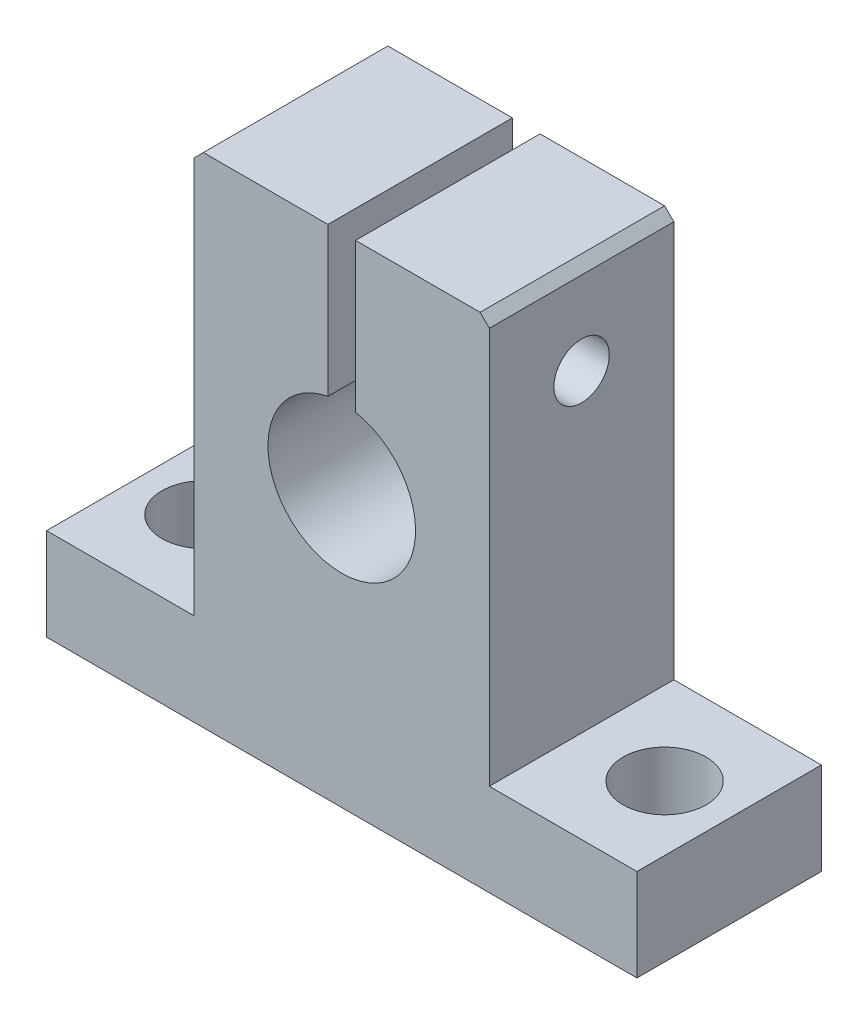
ISO-10303-21;
HEADER;
FILE_DESCRIPTION(('STEP AP214'),'2;1');
FILE_NAME('part.step','',(''),(''),'','','');
FILE_SCHEMA(('AUTOMOTIVE_DESIGN { 1 0 10303 214 1 1 1 1 }'));
ENDSEC;
DATA;
#1=APPLICATION_CONTEXT('core data for automotive mechanical design processes');
#2=APPLICATION_PROTOCOL_DEFINITION('international standard','automotive_design',2000,#1);
#3=PRODUCT_CONTEXT('',#1,'mechanical');
#4=PRODUCT('Part','Part','',(#3));
#5=PRODUCT_RELATED_PRODUCT_CATEGORY('part','',(#4));
#6=PRODUCT_DEFINITION_FORMATION('','',#4);
#7=PRODUCT_DEFINITION_CONTEXT('part definition',#1,'design');
#8=PRODUCT_DEFINITION('design','',#6,#7);
#9=PRODUCT_DEFINITION_SHAPE('','',#8);
#10=(LENGTH_UNIT() NAMED_UNIT(*) SI_UNIT(.MILLI.,.METRE.));
#11=(NAMED_UNIT(*) PLANE_ANGLE_UNIT() SI_UNIT($,.RADIAN.));
#12=(NAMED_UNIT(*) SI_UNIT($,.STERADIAN.) SOLID_ANGLE_UNIT());
#13=UNCERTAINTY_MEASURE_WITH_UNIT(LENGTH_MEASURE(1.E-05),#10,'distance_accuracy_value','');
#14=(GEOMETRIC_REPRESENTATION_CONTEXT(3) GLOBAL_UNCERTAINTY_ASSIGNED_CONTEXT((#13)) GLOBAL_UNIT_ASSIGNED_CONTEXT((#10,
#11,#12)) REPRESENTATION_CONTEXT('',''));
#15=CARTESIAN_POINT('',(0.,0.,0.));
#16=DIRECTION('',(0.,0.,1.));
#17=DIRECTION('',(1.,0.,0.));
#18=AXIS2_PLACEMENT_3D('',#15,#16,#17);
#19=CARTESIAN_POINT('',(8.,0.,0.));
#20=DIRECTION('',(0.,-1.,0.));
#21=DIRECTION('',(-1.,0.,0.));
#22=AXIS2_PLACEMENT_3D('',#19,#20,#21);
#23=PLANE('',#22);
#24=DIRECTION('',(1.,0.,0.));
#25=VECTOR('',#24,1.);
#26=CARTESIAN_POINT('',(0.,0.,-10.));
#27=LINE('',#26,#25);
#28=CARTESIAN_POINT('',(-16.,0.,-10.));
#29=VERTEX_POINT('',#28);
#30=CARTESIAN_POINT('',(16.,0.,-10.));
#31=VERTEX_POINT('',#30);
#32=EDGE_CURVE('E238',#29,#31,#27,.T.);
#33=ORIENTED_EDGE('',*,*,#32,.T.);
#34=DIRECTION('',(0.,0.,-1.));
#35=VECTOR('',#34,1.);
#36=CARTESIAN_POINT('',(16.,0.,0.));
#37=LINE('',#36,#35);
#38=CARTESIAN_POINT('',(16.,0.,0.));
#39=VERTEX_POINT('',#38);
#40=EDGE_CURVE('E396',#39,#31,#37,.T.);
#41=ORIENTED_EDGE('',*,*,#40,.F.);
#42=DIRECTION('',(1.,0.,0.));
#43=VECTOR('',#42,1.);
#44=CARTESIAN_POINT('',(0.,0.,0.));
#45=LINE('',#44,#43);
#46=CARTESIAN_POINT('',(-16.,0.,0.));
#47=VERTEX_POINT('',#46);
#48=EDGE_CURVE('E260',#47,#39,#45,.T.);
#49=ORIENTED_EDGE('',*,*,#48,.F.);
#50=DIRECTION('',(0.,0.,-1.));
#51=VECTOR('',#50,1.);
#52=CARTESIAN_POINT('',(-16.,0.,0.));
#53=LINE('',#52,#51);
#54=EDGE_CURVE('E12',#47,#29,#53,.T.);
#55=ORIENTED_EDGE('',*,*,#54,.T.);
#56=EDGE_LOOP('',(#33,#41,#49,#55));
#57=FACE_BOUND('',#56,.T.);
#58=CARTESIAN_POINT('',(12.5,0.,-5.));
#59=DIRECTION('',(0.,1.,0.));
#60=DIRECTION('',(1.,0.,0.));
#61=AXIS2_PLACEMENT_3D('',#58,#59,#60);
#62=CIRCLE('',#61,2.25);
#63=CARTESIAN_POINT('',(14.75,0.,-5.));
#64=VERTEX_POINT('',#63);
#65=EDGE_CURVE('E284',#64,#64,#62,.T.);
#66=ORIENTED_EDGE('',*,*,#65,.T.);
#67=EDGE_LOOP('',(#66));
#68=FACE_BOUND('',#67,.T.);
#69=CARTESIAN_POINT('',(-12.5,0.,-5.));
#70=DIRECTION('',(0.,1.,0.));
#71=DIRECTION('',(1.,0.,0.));
#72=AXIS2_PLACEMENT_3D('',#69,#70,#71);
#73=CIRCLE('',#72,2.25);
#74=CARTESIAN_POINT('',(-10.25,0.,-5.));
#75=VERTEX_POINT('',#74);
#76=EDGE_CURVE('E254',#75,#75,#73,.T.);
#77=ORIENTED_EDGE('',*,*,#76,.T.);
#78=EDGE_LOOP('',(#77));
#79=FACE_BOUND('',#78,.T.);
#80=ADVANCED_FACE('F20',(#57,#68,#79),#23,.T.);
#81=CARTESIAN_POINT('',(-16.,2.5,0.));
#82=DIRECTION('',(-1.,0.,0.));
#83=DIRECTION('',(0.,1.,0.));
#84=AXIS2_PLACEMENT_3D('',#81,#82,#83);
#85=PLANE('',#84);
#86=DIRECTION('',(0.,-1.,0.));
#87=VECTOR('',#86,1.);
#88=CARTESIAN_POINT('',(-16.,0.,-10.));
#89=LINE('',#88,#87);
#90=CARTESIAN_POINT('',(-16.,5.,-10.));
#91=VERTEX_POINT('',#90);
#92=EDGE_CURVE('E232',#91,#29,#89,.T.);
#93=ORIENTED_EDGE('',*,*,#92,.T.);
#94=ORIENTED_EDGE('',*,*,#54,.F.);
#95=DIRECTION('',(0.,1.,0.));
#96=VECTOR('',#95,1.);
#97=CARTESIAN_POINT('',(-16.,0.,0.));
#98=LINE('',#97,#96);
#99=CARTESIAN_POINT('',(-16.,5.,0.));
#100=VERTEX_POINT('',#99);
#101=EDGE_CURVE('E256',#47,#100,#98,.T.);
#102=ORIENTED_EDGE('',*,*,#101,.T.);
#103=DIRECTION('',(0.,0.,-1.));
#104=VECTOR('',#103,1.);
#105=CARTESIAN_POINT('',(-16.,5.,0.));
#106=LINE('',#105,#104);
#107=EDGE_CURVE('E32',#100,#91,#106,.T.);
#108=ORIENTED_EDGE('',*,*,#107,.T.);
#109=EDGE_LOOP('',(#93,#94,#102,#108));
#110=FACE_BOUND('',#109,.T.);
#111=ADVANCED_FACE('F22',(#110),#85,.T.);
#112=CARTESIAN_POINT('',(-12.,5.,0.));
#113=DIRECTION('',(0.,1.,0.));
#114=DIRECTION('',(1.,0.,0.));
#115=AXIS2_PLACEMENT_3D('',#112,#113,#114);
#116=PLANE('',#115);
#117=DIRECTION('',(-1.,0.,0.));
#118=VECTOR('',#117,1.);
#119=CARTESIAN_POINT('',(-16.,5.,-10.));
#120=LINE('',#119,#118);
#121=CARTESIAN_POINT('',(-8.,5.,-10.));
#122=VERTEX_POINT('',#121);
#123=EDGE_CURVE('E237',#122,#91,#120,.T.);
#124=ORIENTED_EDGE('',*,*,#123,.T.);
#125=ORIENTED_EDGE('',*,*,#107,.F.);
#126=DIRECTION('',(1.,0.,0.));
#127=VECTOR('',#126,1.);
#128=CARTESIAN_POINT('',(-16.,5.,0.));
#129=LINE('',#128,#127);
#130=CARTESIAN_POINT('',(-8.,5.,0.));
#131=VERTEX_POINT('',#130);
#132=EDGE_CURVE('E261',#100,#131,#129,.T.);
#133=ORIENTED_EDGE('',*,*,#132,.T.);
#134=DIRECTION('',(0.,0.,-1.));
#135=VECTOR('',#134,1.);
#136=CARTESIAN_POINT('',(-8.,5.,0.));
#137=LINE('',#136,#135);
#138=EDGE_CURVE('E302',#131,#122,#137,.T.);
#139=ORIENTED_EDGE('',*,*,#138,.T.);
#140=EDGE_LOOP('',(#124,#125,#133,#139));
#141=FACE_BOUND('',#140,.T.);
#142=CARTESIAN_POINT('',(-12.5,5.,-5.));
#143=DIRECTION('',(0.,-1.,0.));
#144=DIRECTION('',(1.,0.,0.));
#145=AXIS2_PLACEMENT_3D('',#142,#143,#144);
#146=CIRCLE('',#145,2.25);
#147=CARTESIAN_POINT('',(-10.25,5.,-5.));
#148=VERTEX_POINT('',#147);
#149=EDGE_CURVE('E280',#148,#148,#146,.T.);
#150=ORIENTED_EDGE('',*,*,#149,.T.);
#151=EDGE_LOOP('',(#150));
#152=FACE_BOUND('',#151,.T.);
#153=ADVANCED_FACE('F429',(#141,#152),#116,.T.);
#154=CARTESIAN_POINT('',(-8.,15.75,0.));
#155=DIRECTION('',(-1.,0.,0.));
#156=DIRECTION('',(0.,1.,0.));
#157=AXIS2_PLACEMENT_3D('',#154,#155,#156);
#158=PLANE('',#157);
#159=DIRECTION('',(0.,-1.,0.));
#160=VECTOR('',#159,1.);
#161=CARTESIAN_POINT('',(-8.,5.,-10.));
#162=LINE('',#161,#160);
#163=CARTESIAN_POINT('',(-8.,26.5,-10.));
#164=VERTEX_POINT('',#163);
#165=EDGE_CURVE('E239',#164,#122,#162,.T.);
#166=ORIENTED_EDGE('',*,*,#165,.T.);
#167=ORIENTED_EDGE('',*,*,#138,.F.);
#168=DIRECTION('',(0.,1.,0.));
#169=VECTOR('',#168,1.);
#170=CARTESIAN_POINT('',(-8.,5.,0.));
#171=LINE('',#170,#169);
#172=CARTESIAN_POINT('',(-8.,26.5,0.));
#173=VERTEX_POINT('',#172);
#174=EDGE_CURVE('E190',#131,#173,#171,.T.);
#175=ORIENTED_EDGE('',*,*,#174,.T.);
#176=DIRECTION('',(0.,0.,-1.));
#177=VECTOR('',#176,1.);
#178=CARTESIAN_POINT('',(-8.,26.5,0.));
#179=LINE('',#178,#177);
#180=EDGE_CURVE('E301',#173,#164,#179,.T.);
#181=ORIENTED_EDGE('',*,*,#180,.T.);
#182=EDGE_LOOP('',(#166,#167,#175,#181));
#183=FACE_BOUND('',#182,.T.);
#184=CARTESIAN_POINT('',(-8.,22.,-5.));
#185=DIRECTION('',(1.,0.,0.));
#186=DIRECTION('',(0.,0.,-1.));
#187=AXIS2_PLACEMENT_3D('',#184,#185,#186);
#188=CIRCLE('',#187,3.);
#189=CARTESIAN_POINT('',(-8.,22.,-8.));
#190=VERTEX_POINT('',#189);
#191=EDGE_CURVE('E201',#190,#190,#188,.T.);
#192=ORIENTED_EDGE('',*,*,#191,.T.);
#193=EDGE_LOOP('',(#192));
#194=FACE_BOUND('',#193,.T.);
#195=ADVANCED_FACE('F299',(#183,#194),#158,.T.);
#196=CARTESIAN_POINT('',(-7.75,26.75,0.));
#197=DIRECTION('',(-0.707106781186548,0.707106781186548,0.));
#198=DIRECTION('',(0.707106781186548,0.707106781186548,0.));
#199=AXIS2_PLACEMENT_3D('',#196,#197,#198);
#200=PLANE('',#199);
#201=DIRECTION('',(-0.707106781186548,-0.707106781186548,0.));
#202=VECTOR('',#201,1.);
#203=CARTESIAN_POINT('',(-8.,26.5,-10.));
#204=LINE('',#203,#202);
#205=CARTESIAN_POINT('',(-7.5,27.,-10.));
#206=VERTEX_POINT('',#205);
#207=EDGE_CURVE('E262',#206,#164,#204,.T.);
#208=ORIENTED_EDGE('',*,*,#207,.T.);
#209=ORIENTED_EDGE('',*,*,#180,.F.);
#210=DIRECTION('',(0.707106781186548,0.707106781186548,0.));
#211=VECTOR('',#210,1.);
#212=CARTESIAN_POINT('',(-8.,26.5,0.));
#213=LINE('',#212,#211);
#214=CARTESIAN_POINT('',(-7.5,27.,0.));
#215=VERTEX_POINT('',#214);
#216=EDGE_CURVE('E285',#173,#215,#213,.T.);
#217=ORIENTED_EDGE('',*,*,#216,.T.);
#218=DIRECTION('',(0.,0.,-1.));
#219=VECTOR('',#218,1.);
#220=CARTESIAN_POINT('',(-7.5,27.,0.));
#221=LINE('',#220,#219);
#222=EDGE_CURVE('E306',#215,#206,#221,.T.);
#223=ORIENTED_EDGE('',*,*,#222,.T.);
#224=EDGE_LOOP('',(#208,#209,#217,#223));
#225=FACE_BOUND('',#224,.T.);
#226=ADVANCED_FACE('F305',(#225),#200,.T.);
#227=CARTESIAN_POINT('',(7.75,26.75,0.));
#228=DIRECTION('',(0.707106781186548,0.707106781186548,0.));
#229=DIRECTION('',(0.707106781186548,-0.707106781186548,0.));
#230=AXIS2_PLACEMENT_3D('',#227,#228,#229);
#231=PLANE('',#230);
#232=DIRECTION('',(-0.707106781186548,0.707106781186548,0.));
#233=VECTOR('',#232,1.);
#234=CARTESIAN_POINT('',(8.,26.5,-10.));
#235=LINE('',#234,#233);
#236=CARTESIAN_POINT('',(8.,26.5,-10.));
#237=VERTEX_POINT('',#236);
#238=CARTESIAN_POINT('',(7.5,27.,-10.));
#239=VERTEX_POINT('',#238);
#240=EDGE_CURVE('E222',#237,#239,#235,.T.);
#241=ORIENTED_EDGE('',*,*,#240,.T.);
#242=DIRECTION('',(0.,0.,-1.));
#243=VECTOR('',#242,1.);
#244=CARTESIAN_POINT('',(7.5,27.,0.));
#245=LINE('',#244,#243);
#246=CARTESIAN_POINT('',(7.5,27.,0.));
#247=VERTEX_POINT('',#246);
#248=EDGE_CURVE('E392',#247,#239,#245,.T.);
#249=ORIENTED_EDGE('',*,*,#248,.F.);
#250=DIRECTION('',(-0.707106781186548,0.707106781186548,0.));
#251=VECTOR('',#250,1.);
#252=CARTESIAN_POINT('',(8.,26.5,0.));
#253=LINE('',#252,#251);
#254=CARTESIAN_POINT('',(8.,26.5,0.));
#255=VERTEX_POINT('',#254);
#256=EDGE_CURVE('E228',#255,#247,#253,.T.);
#257=ORIENTED_EDGE('',*,*,#256,.F.);
#258=DIRECTION('',(0.,0.,-1.));
#259=VECTOR('',#258,1.);
#260=CARTESIAN_POINT('',(8.,26.5,0.));
#261=LINE('',#260,#259);
#262=EDGE_CURVE('E311',#255,#237,#261,.T.);
#263=ORIENTED_EDGE('',*,*,#262,.T.);
#264=EDGE_LOOP('',(#241,#249,#257,#263));
#265=FACE_BOUND('',#264,.T.);
#266=ADVANCED_FACE('F391',(#265),#231,.T.);
#267=CARTESIAN_POINT('',(8.,15.75,0.));
#268=DIRECTION('',(1.,0.,0.));
#269=DIRECTION('',(0.,-1.,0.));
#270=AXIS2_PLACEMENT_3D('',#267,#268,#269);
#271=PLANE('',#270);
#272=DIRECTION('',(0.,1.,0.));
#273=VECTOR('',#272,1.);
#274=CARTESIAN_POINT('',(8.,5.,-10.));
#275=LINE('',#274,#273);
#276=CARTESIAN_POINT('',(8.,5.,-10.));
#277=VERTEX_POINT('',#276);
#278=EDGE_CURVE('E278',#277,#237,#275,.T.);
#279=ORIENTED_EDGE('',*,*,#278,.T.);
#280=ORIENTED_EDGE('',*,*,#262,.F.);
#281=DIRECTION('',(0.,1.,0.));
#282=VECTOR('',#281,1.);
#283=CARTESIAN_POINT('',(8.,5.,0.));
#284=LINE('',#283,#282);
#285=CARTESIAN_POINT('',(8.,5.,0.));
#286=VERTEX_POINT('',#285);
#287=EDGE_CURVE('E231',#286,#255,#284,.T.);
#288=ORIENTED_EDGE('',*,*,#287,.F.);
#289=DIRECTION('',(0.,0.,-1.));
#290=VECTOR('',#289,1.);
#291=CARTESIAN_POINT('',(8.,5.,0.));
#292=LINE('',#291,#290);
#293=EDGE_CURVE('E316',#286,#277,#292,.T.);
#294=ORIENTED_EDGE('',*,*,#293,.T.);
#295=EDGE_LOOP('',(#279,#280,#288,#294));
#296=FACE_BOUND('',#295,.T.);
#297=CARTESIAN_POINT('',(8.,22.,-5.));
#298=DIRECTION('',(-1.,0.,0.));
#299=DIRECTION('',(0.,0.,-1.));
#300=AXIS2_PLACEMENT_3D('',#297,#298,#299);
#301=CIRCLE('',#300,1.5);
#302=CARTESIAN_POINT('',(8.,22.,-6.5));
#303=VERTEX_POINT('',#302);
#304=EDGE_CURVE('E179',#303,#303,#301,.T.);
#305=ORIENTED_EDGE('',*,*,#304,.T.);
#306=EDGE_LOOP('',(#305));
#307=FACE_BOUND('',#306,.T.);
#308=ADVANCED_FACE('F383',(#296,#307),#271,.T.);
#309=CARTESIAN_POINT('',(12.,5.,0.));
#310=DIRECTION('',(0.,1.,0.));
#311=DIRECTION('',(1.,0.,0.));
#312=AXIS2_PLACEMENT_3D('',#309,#310,#311);
#313=PLANE('',#312);
#314=DIRECTION('',(-1.,0.,0.));
#315=VECTOR('',#314,1.);
#316=CARTESIAN_POINT('',(16.,5.,-10.));
#317=LINE('',#316,#315);
#318=CARTESIAN_POINT('',(16.,5.,-10.));
#319=VERTEX_POINT('',#318);
#320=EDGE_CURVE('E354',#319,#277,#317,.T.);
#321=ORIENTED_EDGE('',*,*,#320,.T.);
#322=ORIENTED_EDGE('',*,*,#293,.F.);
#323=DIRECTION('',(-1.,0.,0.));
#324=VECTOR('',#323,1.);
#325=CARTESIAN_POINT('',(16.,5.,0.));
#326=LINE('',#325,#324);
#327=CARTESIAN_POINT('',(16.,5.,0.));
#328=VERTEX_POINT('',#327);
#329=EDGE_CURVE('E338',#328,#286,#326,.T.);
#330=ORIENTED_EDGE('',*,*,#329,.F.);
#331=DIRECTION('',(0.,0.,-1.));
#332=VECTOR('',#331,1.);
#333=CARTESIAN_POINT('',(16.,5.,0.));
#334=LINE('',#333,#332);
#335=EDGE_CURVE('E361',#328,#319,#334,.T.);
#336=ORIENTED_EDGE('',*,*,#335,.T.);
#337=EDGE_LOOP('',(#321,#322,#330,#336));
#338=FACE_BOUND('',#337,.T.);
#339=CARTESIAN_POINT('',(12.5,5.,-5.));
#340=DIRECTION('',(0.,-1.,0.));
#341=DIRECTION('',(1.,0.,0.));
#342=AXIS2_PLACEMENT_3D('',#339,#340,#341);
#343=CIRCLE('',#342,2.25);
#344=CARTESIAN_POINT('',(14.75,5.,-5.));
#345=VERTEX_POINT('',#344);
#346=EDGE_CURVE('E39',#345,#345,#343,.T.);
#347=ORIENTED_EDGE('',*,*,#346,.T.);
#348=EDGE_LOOP('',(#347));
#349=FACE_BOUND('',#348,.T.);
#350=ADVANCED_FACE('F394',(#338,#349),#313,.T.);
#351=CARTESIAN_POINT('',(16.,2.5,0.));
#352=DIRECTION('',(1.,0.,0.));
#353=DIRECTION('',(0.,-1.,0.));
#354=AXIS2_PLACEMENT_3D('',#351,#352,#353);
#355=PLANE('',#354);
#356=DIRECTION('',(0.,1.,0.));
#357=VECTOR('',#356,1.);
#358=CARTESIAN_POINT('',(16.,0.,-10.));
#359=LINE('',#358,#357);
#360=EDGE_CURVE('E349',#31,#319,#359,.T.);
#361=ORIENTED_EDGE('',*,*,#360,.T.);
#362=ORIENTED_EDGE('',*,*,#335,.F.);
#363=DIRECTION('',(0.,1.,0.));
#364=VECTOR('',#363,1.);
#365=CARTESIAN_POINT('',(16.,0.,0.));
#366=LINE('',#365,#364);
#367=EDGE_CURVE('E331',#39,#328,#366,.T.);
#368=ORIENTED_EDGE('',*,*,#367,.F.);
#369=ORIENTED_EDGE('',*,*,#40,.T.);
#370=EDGE_LOOP('',(#361,#362,#368,#369));
#371=FACE_BOUND('',#370,.T.);
#372=ADVANCED_FACE('F426',(#371),#355,.T.);
#373=CARTESIAN_POINT('',(0.,15.,-5.));
#374=DIRECTION('',(0.,0.,1.));
#375=DIRECTION('',(1.,0.,0.));
#376=AXIS2_PLACEMENT_3D('',#373,#374,#375);
#377=CYLINDRICAL_SURFACE('',#376,4.);
#378=DIRECTION('',(0.,0.,1.));
#379=VECTOR('',#378,1.);
#380=CARTESIAN_POINT('',(-0.75,18.9290584113755,-5.));
#381=LINE('',#380,#379);
#382=CARTESIAN_POINT('',(-0.75,18.9290584113755,-10.));
#383=VERTEX_POINT('',#382);
#384=CARTESIAN_POINT('',(-0.75,18.9290584113755,0.));
#385=VERTEX_POINT('',#384);
#386=EDGE_CURVE('E154',#383,#385,#381,.T.);
#387=ORIENTED_EDGE('',*,*,#386,.T.);
#388=CARTESIAN_POINT('',(0.,15.,0.));
#389=DIRECTION('',(0.,0.,-1.));
#390=DIRECTION('',(1.,0.,0.));
#391=AXIS2_PLACEMENT_3D('',#388,#389,#390);
#392=CIRCLE('',#391,4.);
#393=CARTESIAN_POINT('',(0.75,18.9290584113755,0.));
#394=VERTEX_POINT('',#393);
#395=EDGE_CURVE('E148',#394,#385,#392,.T.);
#396=ORIENTED_EDGE('',*,*,#395,.F.);
#397=DIRECTION('',(0.,0.,-1.));
#398=VECTOR('',#397,1.);
#399=CARTESIAN_POINT('',(0.75,18.9290584113755,-5.));
#400=LINE('',#399,#398);
#401=CARTESIAN_POINT('',(0.75,18.9290584113755,-10.));
#402=VERTEX_POINT('',#401);
#403=EDGE_CURVE('E152',#394,#402,#400,.T.);
#404=ORIENTED_EDGE('',*,*,#403,.T.);
#405=CARTESIAN_POINT('',(0.,15.,-10.));
#406=DIRECTION('',(0.,0.,1.));
#407=DIRECTION('',(1.,0.,0.));
#408=AXIS2_PLACEMENT_3D('',#405,#406,#407);
#409=CIRCLE('',#408,4.);
#410=EDGE_CURVE('E406',#383,#402,#409,.T.);
#411=ORIENTED_EDGE('',*,*,#410,.F.);
#412=EDGE_LOOP('',(#387,#396,#404,#411));
#413=FACE_BOUND('',#412,.T.);
#414=ADVANCED_FACE('F150',(#413),#377,.F.);
#415=CARTESIAN_POINT('',(12.5,2.5,-5.));
#416=DIRECTION('',(0.,-1.,0.));
#417=DIRECTION('',(1.,0.,0.));
#418=AXIS2_PLACEMENT_3D('',#415,#416,#417);
#419=CYLINDRICAL_SURFACE('',#418,2.25);
#420=ORIENTED_EDGE('',*,*,#346,.F.);
#421=EDGE_LOOP('',(#420));
#422=FACE_BOUND('',#421,.T.);
#423=ORIENTED_EDGE('',*,*,#65,.F.);
#424=EDGE_LOOP('',(#423));
#425=FACE_BOUND('',#424,.T.);
#426=ADVANCED_FACE('F438',(#422,#425),#419,.F.);
#427=CARTESIAN_POINT('',(-12.5,2.5,-5.));
#428=DIRECTION('',(0.,-1.,0.));
#429=DIRECTION('',(1.,0.,0.));
#430=AXIS2_PLACEMENT_3D('',#427,#428,#429);
#431=CYLINDRICAL_SURFACE('',#430,2.25);
#432=ORIENTED_EDGE('',*,*,#149,.F.);
#433=EDGE_LOOP('',(#432));
#434=FACE_BOUND('',#433,.T.);
#435=ORIENTED_EDGE('',*,*,#76,.F.);
#436=EDGE_LOOP('',(#435));
#437=FACE_BOUND('',#436,.T.);
#438=ADVANCED_FACE('F435',(#434,#437),#431,.F.);
#439=CARTESIAN_POINT('',(0.,27.,0.));
#440=DIRECTION('',(0.,1.,0.));
#441=DIRECTION('',(1.,0.,0.));
#442=AXIS2_PLACEMENT_3D('',#439,#440,#441);
#443=PLANE('',#442);
#444=DIRECTION('',(0.,0.,-1.));
#445=VECTOR('',#444,1.);
#446=CARTESIAN_POINT('',(-0.75,27.,-2.5));
#447=LINE('',#446,#445);
#448=CARTESIAN_POINT('',(-0.75,27.,0.));
#449=VERTEX_POINT('',#448);
#450=CARTESIAN_POINT('',(-0.75,27.,-10.));
#451=VERTEX_POINT('',#450);
#452=EDGE_CURVE('E206',#449,#451,#447,.T.);
#453=ORIENTED_EDGE('',*,*,#452,.T.);
#454=DIRECTION('',(-1.,0.,0.));
#455=VECTOR('',#454,1.);
#456=CARTESIAN_POINT('',(7.5,27.,-10.));
#457=LINE('',#456,#455);
#458=EDGE_CURVE('E219',#451,#206,#457,.T.);
#459=ORIENTED_EDGE('',*,*,#458,.T.);
#460=ORIENTED_EDGE('',*,*,#222,.F.);
#461=DIRECTION('',(-1.,0.,0.));
#462=VECTOR('',#461,1.);
#463=CARTESIAN_POINT('',(7.5,27.,0.));
#464=LINE('',#463,#462);
#465=EDGE_CURVE('E288',#449,#215,#464,.T.);
#466=ORIENTED_EDGE('',*,*,#465,.F.);
#467=EDGE_LOOP('',(#453,#459,#460,#466));
#468=FACE_BOUND('',#467,.T.);
#469=ADVANCED_FACE('F412',(#468),#443,.T.);
#470=CARTESIAN_POINT('',(0.,27.,0.));
#471=DIRECTION('',(0.,1.,0.));
#472=DIRECTION('',(1.,0.,0.));
#473=AXIS2_PLACEMENT_3D('',#470,#471,#472);
#474=PLANE('',#473);
#475=DIRECTION('',(0.,0.,1.));
#476=VECTOR('',#475,1.);
#477=CARTESIAN_POINT('',(0.75,27.,-2.5));
#478=LINE('',#477,#476);
#479=CARTESIAN_POINT('',(0.75,27.,-10.));
#480=VERTEX_POINT('',#479);
#481=CARTESIAN_POINT('',(0.75,27.,0.));
#482=VERTEX_POINT('',#481);
#483=EDGE_CURVE('E171',#480,#482,#478,.T.);
#484=ORIENTED_EDGE('',*,*,#483,.T.);
#485=DIRECTION('',(-1.,0.,0.));
#486=VECTOR('',#485,1.);
#487=CARTESIAN_POINT('',(7.5,27.,0.));
#488=LINE('',#487,#486);
#489=EDGE_CURVE('E160',#247,#482,#488,.T.);
#490=ORIENTED_EDGE('',*,*,#489,.F.);
#491=ORIENTED_EDGE('',*,*,#248,.T.);
#492=DIRECTION('',(-1.,0.,0.));
#493=VECTOR('',#492,1.);
#494=CARTESIAN_POINT('',(7.5,27.,-10.));
#495=LINE('',#494,#493);
#496=EDGE_CURVE('E159',#239,#480,#495,.T.);
#497=ORIENTED_EDGE('',*,*,#496,.T.);
#498=EDGE_LOOP('',(#484,#490,#491,#497));
#499=FACE_BOUND('',#498,.T.);
#500=ADVANCED_FACE('F450',(#499),#474,.T.);
#501=CARTESIAN_POINT('',(0.,10.4338322901826,-10.));
#502=DIRECTION('',(0.,0.,1.));
#503=DIRECTION('',(1.,0.,0.));
#504=AXIS2_PLACEMENT_3D('',#501,#502,#503);
#505=PLANE('',#504);
#506=DIRECTION('',(0.,1.,0.));
#507=VECTOR('',#506,1.);
#508=CARTESIAN_POINT('',(0.75,15.7169161450913,-10.));
#509=LINE('',#508,#507);
#510=EDGE_CURVE('E177',#402,#480,#509,.T.);
#511=ORIENTED_EDGE('',*,*,#510,.T.);
#512=ORIENTED_EDGE('',*,*,#496,.F.);
#513=ORIENTED_EDGE('',*,*,#240,.F.);
#514=ORIENTED_EDGE('',*,*,#278,.F.);
#515=ORIENTED_EDGE('',*,*,#320,.F.);
#516=ORIENTED_EDGE('',*,*,#360,.F.);
#517=ORIENTED_EDGE('',*,*,#32,.F.);
#518=ORIENTED_EDGE('',*,*,#92,.F.);
#519=ORIENTED_EDGE('',*,*,#123,.F.);
#520=ORIENTED_EDGE('',*,*,#165,.F.);
#521=ORIENTED_EDGE('',*,*,#207,.F.);
#522=ORIENTED_EDGE('',*,*,#458,.F.);
#523=DIRECTION('',(0.,-1.,0.));
#524=VECTOR('',#523,1.);
#525=CARTESIAN_POINT('',(-0.75,15.7169161450913,-10.));
#526=LINE('',#525,#524);
#527=EDGE_CURVE('E205',#451,#383,#526,.T.);
#528=ORIENTED_EDGE('',*,*,#527,.T.);
#529=ORIENTED_EDGE('',*,*,#410,.T.);
#530=EDGE_LOOP('',(#511,#512,#513,#514,#515,#516,#517,#518,#519,#520,#521,#522,#528,#529));
#531=FACE_BOUND('',#530,.T.);
#532=ADVANCED_FACE('F389',(#531),#505,.F.);
#533=CARTESIAN_POINT('',(0.,10.4338322901826,0.));
#534=DIRECTION('',(0.,0.,1.));
#535=DIRECTION('',(1.,0.,0.));
#536=AXIS2_PLACEMENT_3D('',#533,#534,#535);
#537=PLANE('',#536);
#538=DIRECTION('',(0.,1.,0.));
#539=VECTOR('',#538,1.);
#540=CARTESIAN_POINT('',(-0.75,15.7169161450913,0.));
#541=LINE('',#540,#539);
#542=EDGE_CURVE('E24',#385,#449,#541,.T.);
#543=ORIENTED_EDGE('',*,*,#542,.T.);
#544=ORIENTED_EDGE('',*,*,#465,.T.);
#545=ORIENTED_EDGE('',*,*,#216,.F.);
#546=ORIENTED_EDGE('',*,*,#174,.F.);
#547=ORIENTED_EDGE('',*,*,#132,.F.);
#548=ORIENTED_EDGE('',*,*,#101,.F.);
#549=ORIENTED_EDGE('',*,*,#48,.T.);
#550=ORIENTED_EDGE('',*,*,#367,.T.);
#551=ORIENTED_EDGE('',*,*,#329,.T.);
#552=ORIENTED_EDGE('',*,*,#287,.T.);
#553=ORIENTED_EDGE('',*,*,#256,.T.);
#554=ORIENTED_EDGE('',*,*,#489,.T.);
#555=DIRECTION('',(0.,-1.,0.));
#556=VECTOR('',#555,1.);
#557=CARTESIAN_POINT('',(0.75,15.7169161450913,0.));
#558=LINE('',#557,#556);
#559=EDGE_CURVE('E163',#482,#394,#558,.T.);
#560=ORIENTED_EDGE('',*,*,#559,.T.);
#561=ORIENTED_EDGE('',*,*,#395,.T.);
#562=EDGE_LOOP('',(#543,#544,#545,#546,#547,#548,#549,#550,#551,#552,#553,#554,#560,#561));
#563=FACE_BOUND('',#562,.T.);
#564=ADVANCED_FACE('F164',(#563),#537,.T.);
#565=CARTESIAN_POINT('',(-0.75,21.,-5.));
#566=DIRECTION('',(1.,0.,0.));
#567=DIRECTION('',(0.,0.,-1.));
#568=AXIS2_PLACEMENT_3D('',#565,#566,#567);
#569=PLANE('',#568);
#570=ORIENTED_EDGE('',*,*,#386,.F.);
#571=ORIENTED_EDGE('',*,*,#527,.F.);
#572=ORIENTED_EDGE('',*,*,#452,.F.);
#573=ORIENTED_EDGE('',*,*,#542,.F.);
#574=EDGE_LOOP('',(#570,#571,#572,#573));
#575=FACE_BOUND('',#574,.T.);
#576=CARTESIAN_POINT('',(-0.75,22.,-5.));
#577=DIRECTION('',(-1.,0.,0.));
#578=DIRECTION('',(0.,0.,-1.));
#579=AXIS2_PLACEMENT_3D('',#576,#577,#578);
#580=CIRCLE('',#579,1.5);
#581=CARTESIAN_POINT('',(-0.75,22.,-3.5));
#582=VERTEX_POINT('',#581);
#583=EDGE_CURVE('E223',#582,#582,#580,.T.);
#584=ORIENTED_EDGE('',*,*,#583,.T.);
#585=EDGE_LOOP('',(#584));
#586=FACE_BOUND('',#585,.T.);
#587=ADVANCED_FACE('F486',(#575,#586),#569,.T.);
#588=CARTESIAN_POINT('',(0.75,21.,-5.));
#589=DIRECTION('',(-1.,0.,0.));
#590=DIRECTION('',(0.,0.,1.));
#591=AXIS2_PLACEMENT_3D('',#588,#589,#590);
#592=PLANE('',#591);
#593=ORIENTED_EDGE('',*,*,#403,.F.);
#594=ORIENTED_EDGE('',*,*,#559,.F.);
#595=ORIENTED_EDGE('',*,*,#483,.F.);
#596=ORIENTED_EDGE('',*,*,#510,.F.);
#597=EDGE_LOOP('',(#593,#594,#595,#596));
#598=FACE_BOUND('',#597,.T.);
#599=CARTESIAN_POINT('',(0.75,22.,-5.));
#600=DIRECTION('',(1.,0.,0.));
#601=DIRECTION('',(0.,0.,-1.));
#602=AXIS2_PLACEMENT_3D('',#599,#600,#601);
#603=CIRCLE('',#602,1.5);
#604=CARTESIAN_POINT('',(0.75,22.,-3.5));
#605=VERTEX_POINT('',#604);
#606=EDGE_CURVE('E183',#605,#605,#603,.T.);
#607=ORIENTED_EDGE('',*,*,#606,.T.);
#608=EDGE_LOOP('',(#607));
#609=FACE_BOUND('',#608,.T.);
#610=ADVANCED_FACE('F174',(#598,#609),#592,.T.);
#611=CARTESIAN_POINT('',(0.,22.,-5.));
#612=DIRECTION('',(-1.,0.,0.));
#613=DIRECTION('',(0.,0.,-1.));
#614=AXIS2_PLACEMENT_3D('',#611,#612,#613);
#615=CYLINDRICAL_SURFACE('',#614,1.5);
#616=ORIENTED_EDGE('',*,*,#304,.F.);
#617=EDGE_LOOP('',(#616));
#618=FACE_BOUND('',#617,.T.);
#619=ORIENTED_EDGE('',*,*,#606,.F.);
#620=EDGE_LOOP('',(#619));
#621=FACE_BOUND('',#620,.T.);
#622=ADVANCED_FACE('F473',(#618,#621),#615,.F.);
#623=CARTESIAN_POINT('',(-6.5,22.,-5.));
#624=DIRECTION('',(-1.,0.,0.));
#625=DIRECTION('',(0.,0.,-1.));
#626=AXIS2_PLACEMENT_3D('',#623,#624,#625);
#627=CYLINDRICAL_SURFACE('',#626,3.);
#628=CARTESIAN_POINT('',(-5.,22.,-5.));
#629=DIRECTION('',(1.,0.,0.));
#630=DIRECTION('',(0.,0.,-1.));
#631=AXIS2_PLACEMENT_3D('',#628,#629,#630);
#632=CIRCLE('',#631,3.);
#633=CARTESIAN_POINT('',(-5.,22.,-8.));
#634=VERTEX_POINT('',#633);
#635=EDGE_CURVE('E188',#634,#634,#632,.T.);
#636=ORIENTED_EDGE('',*,*,#635,.T.);
#637=EDGE_LOOP('',(#636));
#638=FACE_BOUND('',#637,.T.);
#639=ORIENTED_EDGE('',*,*,#191,.F.);
#640=EDGE_LOOP('',(#639));
#641=FACE_BOUND('',#640,.T.);
#642=ADVANCED_FACE('F471',(#638,#641),#627,.F.);
#643=CARTESIAN_POINT('',(-5.,22.,-5.));
#644=DIRECTION('',(1.,0.,0.));
#645=DIRECTION('',(0.,0.,-1.));
#646=AXIS2_PLACEMENT_3D('',#643,#644,#645);
#647=PLANE('',#646);
#648=CARTESIAN_POINT('',(-5.,22.,-5.));
#649=DIRECTION('',(1.,0.,0.));
#650=DIRECTION('',(0.,0.,-1.));
#651=AXIS2_PLACEMENT_3D('',#648,#649,#650);
#652=CIRCLE('',#651,1.5);
#653=CARTESIAN_POINT('',(-5.,22.,-3.5));
#654=VERTEX_POINT('',#653);
#655=EDGE_CURVE('E227',#654,#654,#652,.T.);
#656=ORIENTED_EDGE('',*,*,#655,.T.);
#657=EDGE_LOOP('',(#656));
#658=FACE_BOUND('',#657,.T.);
#659=ORIENTED_EDGE('',*,*,#635,.F.);
#660=EDGE_LOOP('',(#659));
#661=FACE_BOUND('',#660,.T.);
#662=ADVANCED_FACE('F465',(#658,#661),#647,.F.);
#663=CARTESIAN_POINT('',(0.,22.,-5.));
#664=DIRECTION('',(-1.,0.,0.));
#665=DIRECTION('',(0.,0.,-1.));
#666=AXIS2_PLACEMENT_3D('',#663,#664,#665);
#667=CYLINDRICAL_SURFACE('',#666,1.5);
#668=ORIENTED_EDGE('',*,*,#655,.F.);
#669=EDGE_LOOP('',(#668));
#670=FACE_BOUND('',#669,.T.);
#671=ORIENTED_EDGE('',*,*,#583,.F.);
#672=EDGE_LOOP('',(#671));
#673=FACE_BOUND('',#672,.T.);
#674=ADVANCED_FACE('F463',(#670,#673),#667,.F.);
#675=CLOSED_SHELL('',(#80,#111,#153,#195,#226,#266,#308,#350,#372,#414,#426,#438,#469,#500,#532,
#564,#587,#610,#622,#642,#662,#674));
#676=MANIFOLD_SOLID_BREP('B1',#675);
#677=ADVANCED_BREP_SHAPE_REPRESENTATION('',(#18,#676),#14);
#678=SHAPE_DEFINITION_REPRESENTATION(#9,#677);
ENDSEC;
END-ISO-10303-21;
